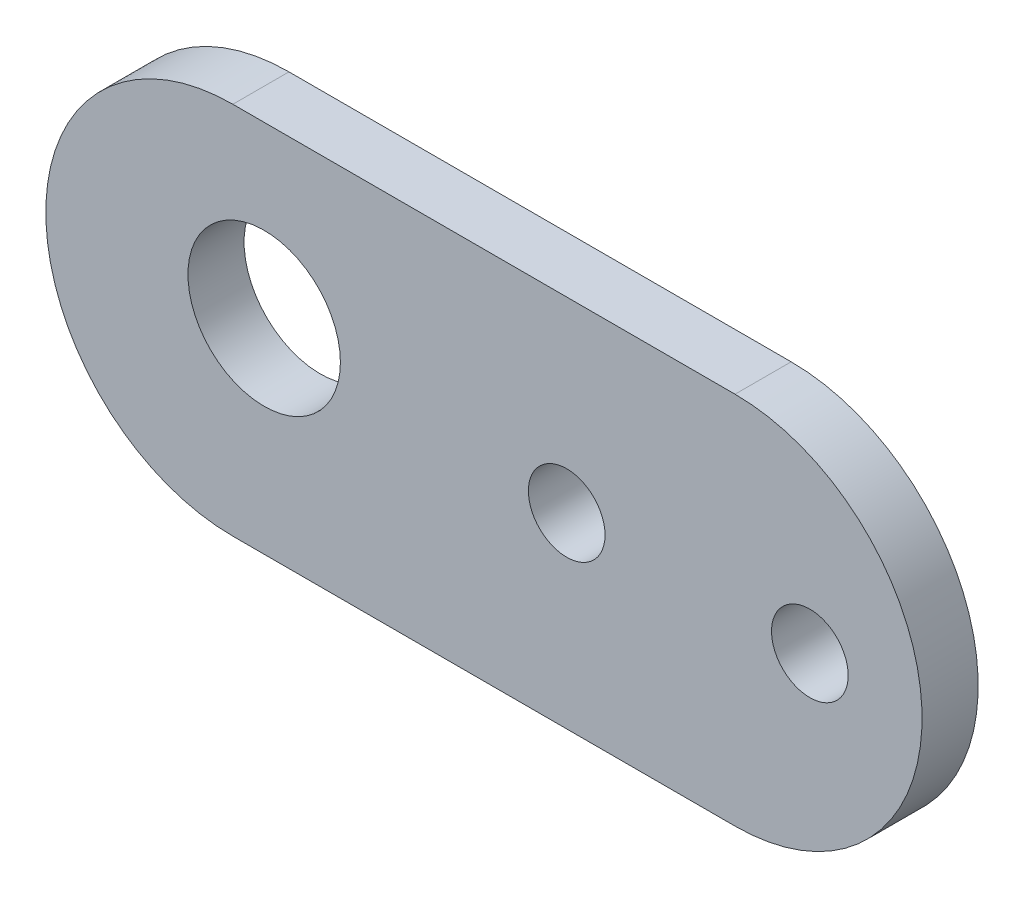
ISO-10303-21;
HEADER;
FILE_DESCRIPTION(('STEP AP214'),'2;1');
FILE_NAME('part.step','',(''),(''),'','','');
FILE_SCHEMA(('AUTOMOTIVE_DESIGN { 1 0 10303 214 1 1 1 1 }'));
ENDSEC;
DATA;
#1=APPLICATION_CONTEXT('core data for automotive mechanical design processes');
#2=APPLICATION_PROTOCOL_DEFINITION('international standard','automotive_design',2000,#1);
#3=PRODUCT_CONTEXT('',#1,'mechanical');
#4=PRODUCT('Part','Part','',(#3));
#5=PRODUCT_RELATED_PRODUCT_CATEGORY('part','',(#4));
#6=PRODUCT_DEFINITION_FORMATION('','',#4);
#7=PRODUCT_DEFINITION_CONTEXT('part definition',#1,'design');
#8=PRODUCT_DEFINITION('design','',#6,#7);
#9=PRODUCT_DEFINITION_SHAPE('','',#8);
#10=(LENGTH_UNIT() NAMED_UNIT(*) SI_UNIT(.MILLI.,.METRE.));
#11=(NAMED_UNIT(*) PLANE_ANGLE_UNIT() SI_UNIT($,.RADIAN.));
#12=(NAMED_UNIT(*) SI_UNIT($,.STERADIAN.) SOLID_ANGLE_UNIT());
#13=UNCERTAINTY_MEASURE_WITH_UNIT(LENGTH_MEASURE(1.E-05),#10,'distance_accuracy_value','');
#14=(GEOMETRIC_REPRESENTATION_CONTEXT(3) GLOBAL_UNCERTAINTY_ASSIGNED_CONTEXT((#13)) GLOBAL_UNIT_ASSIGNED_CONTEXT((#10,
#11,#12)) REPRESENTATION_CONTEXT('',''));
#15=CARTESIAN_POINT('',(0.,0.,0.));
#16=DIRECTION('',(0.,0.,1.));
#17=DIRECTION('',(1.,0.,0.));
#18=AXIS2_PLACEMENT_3D('',#15,#16,#17);
#19=CARTESIAN_POINT('',(-13.425,0.,1.5));
#20=DIRECTION('',(0.,0.,-1.));
#21=DIRECTION('',(-1.,0.,0.));
#22=AXIS2_PLACEMENT_3D('',#19,#20,#21);
#23=CYLINDRICAL_SURFACE('',#22,10.);
#24=CARTESIAN_POINT('',(-13.425,0.,-1.5));
#25=DIRECTION('',(0.,0.,1.));
#26=DIRECTION('',(1.,0.,0.));
#27=AXIS2_PLACEMENT_3D('',#24,#25,#26);
#28=CIRCLE('',#27,10.);
#29=CARTESIAN_POINT('',(-13.425,10.,-1.5));
#30=VERTEX_POINT('',#29);
#31=CARTESIAN_POINT('',(-13.425,-10.,-1.5));
#32=VERTEX_POINT('',#31);
#33=EDGE_CURVE('E95',#30,#32,#28,.T.);
#34=ORIENTED_EDGE('',*,*,#33,.T.);
#35=DIRECTION('',(0.,0.,-1.));
#36=VECTOR('',#35,1.);
#37=CARTESIAN_POINT('',(-13.425,-10.,1.5));
#38=LINE('',#37,#36);
#39=CARTESIAN_POINT('',(-13.425,-10.,1.5));
#40=VERTEX_POINT('',#39);
#41=EDGE_CURVE('E11',#40,#32,#38,.T.);
#42=ORIENTED_EDGE('',*,*,#41,.F.);
#43=CARTESIAN_POINT('',(-13.425,0.,1.5));
#44=DIRECTION('',(0.,0.,1.));
#45=DIRECTION('',(1.,0.,0.));
#46=AXIS2_PLACEMENT_3D('',#43,#44,#45);
#47=CIRCLE('',#46,10.);
#48=CARTESIAN_POINT('',(-13.425,10.,1.5));
#49=VERTEX_POINT('',#48);
#50=EDGE_CURVE('E83',#49,#40,#47,.T.);
#51=ORIENTED_EDGE('',*,*,#50,.F.);
#52=DIRECTION('',(0.,0.,-1.));
#53=VECTOR('',#52,1.);
#54=CARTESIAN_POINT('',(-13.425,10.,1.5));
#55=LINE('',#54,#53);
#56=EDGE_CURVE('E91',#49,#30,#55,.T.);
#57=ORIENTED_EDGE('',*,*,#56,.T.);
#58=EDGE_LOOP('',(#34,#42,#51,#57));
#59=FACE_BOUND('',#58,.T.);
#60=ADVANCED_FACE('F32',(#59),#23,.T.);
#61=CARTESIAN_POINT('',(-13.425,-10.,1.5));
#62=DIRECTION('',(0.,1.,0.));
#63=DIRECTION('',(0.,0.,1.));
#64=AXIS2_PLACEMENT_3D('',#61,#62,#63);
#65=PLANE('',#64);
#66=DIRECTION('',(1.,0.,0.));
#67=VECTOR('',#66,1.);
#68=CARTESIAN_POINT('',(-13.425,-10.,-1.5));
#69=LINE('',#68,#67);
#70=CARTESIAN_POINT('',(13.425,-10.,-1.5));
#71=VERTEX_POINT('',#70);
#72=EDGE_CURVE('E87',#32,#71,#69,.T.);
#73=ORIENTED_EDGE('',*,*,#72,.T.);
#74=DIRECTION('',(0.,0.,-1.));
#75=VECTOR('',#74,1.);
#76=CARTESIAN_POINT('',(13.425,-10.,1.5));
#77=LINE('',#76,#75);
#78=CARTESIAN_POINT('',(13.425,-10.,1.5));
#79=VERTEX_POINT('',#78);
#80=EDGE_CURVE('E40',#79,#71,#77,.T.);
#81=ORIENTED_EDGE('',*,*,#80,.F.);
#82=DIRECTION('',(1.,0.,0.));
#83=VECTOR('',#82,1.);
#84=CARTESIAN_POINT('',(-13.425,-10.,1.5));
#85=LINE('',#84,#83);
#86=EDGE_CURVE('E78',#40,#79,#85,.T.);
#87=ORIENTED_EDGE('',*,*,#86,.F.);
#88=ORIENTED_EDGE('',*,*,#41,.T.);
#89=EDGE_LOOP('',(#73,#81,#87,#88));
#90=FACE_BOUND('',#89,.T.);
#91=ADVANCED_FACE('F86',(#90),#65,.F.);
#92=CARTESIAN_POINT('',(13.425,0.,1.5));
#93=DIRECTION('',(0.,0.,-1.));
#94=DIRECTION('',(-1.,0.,0.));
#95=AXIS2_PLACEMENT_3D('',#92,#93,#94);
#96=CYLINDRICAL_SURFACE('',#95,10.);
#97=CARTESIAN_POINT('',(13.425,0.,-1.5));
#98=DIRECTION('',(0.,0.,1.));
#99=DIRECTION('',(1.,0.,0.));
#100=AXIS2_PLACEMENT_3D('',#97,#98,#99);
#101=CIRCLE('',#100,10.);
#102=CARTESIAN_POINT('',(13.425,10.,-1.5));
#103=VERTEX_POINT('',#102);
#104=EDGE_CURVE('E65',#71,#103,#101,.T.);
#105=ORIENTED_EDGE('',*,*,#104,.T.);
#106=DIRECTION('',(0.,0.,-1.));
#107=VECTOR('',#106,1.);
#108=CARTESIAN_POINT('',(13.425,10.,1.5));
#109=LINE('',#108,#107);
#110=CARTESIAN_POINT('',(13.425,10.,1.5));
#111=VERTEX_POINT('',#110);
#112=EDGE_CURVE('E88',#111,#103,#109,.T.);
#113=ORIENTED_EDGE('',*,*,#112,.F.);
#114=CARTESIAN_POINT('',(13.425,0.,1.5));
#115=DIRECTION('',(0.,0.,1.));
#116=DIRECTION('',(1.,0.,0.));
#117=AXIS2_PLACEMENT_3D('',#114,#115,#116);
#118=CIRCLE('',#117,10.);
#119=EDGE_CURVE('E81',#79,#111,#118,.T.);
#120=ORIENTED_EDGE('',*,*,#119,.F.);
#121=ORIENTED_EDGE('',*,*,#80,.T.);
#122=EDGE_LOOP('',(#105,#113,#120,#121));
#123=FACE_BOUND('',#122,.T.);
#124=ADVANCED_FACE('F89',(#123),#96,.T.);
#125=CARTESIAN_POINT('',(-13.425,10.,1.5));
#126=DIRECTION('',(0.,-1.,0.));
#127=DIRECTION('',(0.,0.,-1.));
#128=AXIS2_PLACEMENT_3D('',#125,#126,#127);
#129=PLANE('',#128);
#130=DIRECTION('',(-1.,0.,0.));
#131=VECTOR('',#130,1.);
#132=CARTESIAN_POINT('',(-13.425,10.,-1.5));
#133=LINE('',#132,#131);
#134=EDGE_CURVE('E71',#103,#30,#133,.T.);
#135=ORIENTED_EDGE('',*,*,#134,.T.);
#136=ORIENTED_EDGE('',*,*,#56,.F.);
#137=DIRECTION('',(-1.,0.,0.));
#138=VECTOR('',#137,1.);
#139=CARTESIAN_POINT('',(-13.425,10.,1.5));
#140=LINE('',#139,#138);
#141=EDGE_CURVE('E48',#111,#49,#140,.T.);
#142=ORIENTED_EDGE('',*,*,#141,.F.);
#143=ORIENTED_EDGE('',*,*,#112,.T.);
#144=EDGE_LOOP('',(#135,#136,#142,#143));
#145=FACE_BOUND('',#144,.T.);
#146=ADVANCED_FACE('F103',(#145),#129,.F.);
#147=CARTESIAN_POINT('',(-13.425,0.,1.5));
#148=DIRECTION('',(0.,0.,1.));
#149=DIRECTION('',(1.,0.,0.));
#150=AXIS2_PLACEMENT_3D('',#147,#148,#149);
#151=PLANE('',#150);
#152=CARTESIAN_POINT('',(-11.75,0.925,1.5));
#153=DIRECTION('',(0.,0.,1.));
#154=DIRECTION('',(1.,0.,0.));
#155=AXIS2_PLACEMENT_3D('',#152,#153,#154);
#156=CIRCLE('',#155,4.075);
#157=CARTESIAN_POINT('',(-7.675,0.925,1.5));
#158=VERTEX_POINT('',#157);
#159=EDGE_CURVE('E121',#158,#158,#156,.T.);
#160=ORIENTED_EDGE('',*,*,#159,.F.);
#161=EDGE_LOOP('',(#160));
#162=FACE_BOUND('',#161,.T.);
#163=CARTESIAN_POINT('',(4.425,0.,1.5));
#164=DIRECTION('',(0.,0.,1.));
#165=DIRECTION('',(1.,0.,0.));
#166=AXIS2_PLACEMENT_3D('',#163,#164,#165);
#167=CIRCLE('',#166,2.05);
#168=CARTESIAN_POINT('',(6.475,0.,1.5));
#169=VERTEX_POINT('',#168);
#170=EDGE_CURVE('E116',#169,#169,#167,.T.);
#171=ORIENTED_EDGE('',*,*,#170,.F.);
#172=EDGE_LOOP('',(#171));
#173=FACE_BOUND('',#172,.T.);
#174=CARTESIAN_POINT('',(17.425,0.,1.5));
#175=DIRECTION('',(0.,0.,1.));
#176=DIRECTION('',(1.,0.,0.));
#177=AXIS2_PLACEMENT_3D('',#174,#175,#176);
#178=CIRCLE('',#177,2.05);
#179=CARTESIAN_POINT('',(19.475,0.,1.5));
#180=VERTEX_POINT('',#179);
#181=EDGE_CURVE('E109',#180,#180,#178,.T.);
#182=ORIENTED_EDGE('',*,*,#181,.F.);
#183=EDGE_LOOP('',(#182));
#184=FACE_BOUND('',#183,.T.);
#185=ORIENTED_EDGE('',*,*,#50,.T.);
#186=ORIENTED_EDGE('',*,*,#86,.T.);
#187=ORIENTED_EDGE('',*,*,#119,.T.);
#188=ORIENTED_EDGE('',*,*,#141,.T.);
#189=EDGE_LOOP('',(#185,#186,#187,#188));
#190=FACE_BOUND('',#189,.T.);
#191=ADVANCED_FACE('F79',(#162,#173,#184,#190),#151,.T.);
#192=CARTESIAN_POINT('',(-13.425,0.,-1.5));
#193=DIRECTION('',(0.,0.,1.));
#194=DIRECTION('',(1.,0.,0.));
#195=AXIS2_PLACEMENT_3D('',#192,#193,#194);
#196=PLANE('',#195);
#197=CARTESIAN_POINT('',(-11.75,0.925,-1.5));
#198=DIRECTION('',(0.,0.,1.));
#199=DIRECTION('',(1.,0.,0.));
#200=AXIS2_PLACEMENT_3D('',#197,#198,#199);
#201=CIRCLE('',#200,4.075);
#202=CARTESIAN_POINT('',(-7.675,0.925,-1.5));
#203=VERTEX_POINT('',#202);
#204=EDGE_CURVE('E113',#203,#203,#201,.T.);
#205=ORIENTED_EDGE('',*,*,#204,.T.);
#206=EDGE_LOOP('',(#205));
#207=FACE_BOUND('',#206,.T.);
#208=CARTESIAN_POINT('',(4.425,0.,-1.5));
#209=DIRECTION('',(0.,0.,1.));
#210=DIRECTION('',(1.,0.,0.));
#211=AXIS2_PLACEMENT_3D('',#208,#209,#210);
#212=CIRCLE('',#211,2.05);
#213=CARTESIAN_POINT('',(6.475,0.,-1.5));
#214=VERTEX_POINT('',#213);
#215=EDGE_CURVE('E98',#214,#214,#212,.T.);
#216=ORIENTED_EDGE('',*,*,#215,.T.);
#217=EDGE_LOOP('',(#216));
#218=FACE_BOUND('',#217,.T.);
#219=CARTESIAN_POINT('',(17.425,0.,-1.5));
#220=DIRECTION('',(0.,0.,1.));
#221=DIRECTION('',(1.,0.,0.));
#222=AXIS2_PLACEMENT_3D('',#219,#220,#221);
#223=CIRCLE('',#222,2.05);
#224=CARTESIAN_POINT('',(19.475,0.,-1.5));
#225=VERTEX_POINT('',#224);
#226=EDGE_CURVE('E112',#225,#225,#223,.T.);
#227=ORIENTED_EDGE('',*,*,#226,.T.);
#228=EDGE_LOOP('',(#227));
#229=FACE_BOUND('',#228,.T.);
#230=ORIENTED_EDGE('',*,*,#33,.F.);
#231=ORIENTED_EDGE('',*,*,#134,.F.);
#232=ORIENTED_EDGE('',*,*,#104,.F.);
#233=ORIENTED_EDGE('',*,*,#72,.F.);
#234=EDGE_LOOP('',(#230,#231,#232,#233));
#235=FACE_BOUND('',#234,.T.);
#236=ADVANCED_FACE('F106',(#207,#218,#229,#235),#196,.F.);
#237=CARTESIAN_POINT('',(17.425,0.,-1.5));
#238=DIRECTION('',(0.,0.,1.));
#239=DIRECTION('',(1.,0.,0.));
#240=AXIS2_PLACEMENT_3D('',#237,#238,#239);
#241=CYLINDRICAL_SURFACE('',#240,2.05);
#242=ORIENTED_EDGE('',*,*,#226,.F.);
#243=EDGE_LOOP('',(#242));
#244=FACE_BOUND('',#243,.T.);
#245=ORIENTED_EDGE('',*,*,#181,.T.);
#246=EDGE_LOOP('',(#245));
#247=FACE_BOUND('',#246,.T.);
#248=ADVANCED_FACE('F143',(#244,#247),#241,.F.);
#249=CARTESIAN_POINT('',(4.425,0.,-1.5));
#250=DIRECTION('',(0.,0.,1.));
#251=DIRECTION('',(1.,0.,0.));
#252=AXIS2_PLACEMENT_3D('',#249,#250,#251);
#253=CYLINDRICAL_SURFACE('',#252,2.05);
#254=ORIENTED_EDGE('',*,*,#215,.F.);
#255=EDGE_LOOP('',(#254));
#256=FACE_BOUND('',#255,.T.);
#257=ORIENTED_EDGE('',*,*,#170,.T.);
#258=EDGE_LOOP('',(#257));
#259=FACE_BOUND('',#258,.T.);
#260=ADVANCED_FACE('F132',(#256,#259),#253,.F.);
#261=CARTESIAN_POINT('',(-11.75,0.925,-1.5));
#262=DIRECTION('',(0.,0.,1.));
#263=DIRECTION('',(1.,0.,0.));
#264=AXIS2_PLACEMENT_3D('',#261,#262,#263);
#265=CYLINDRICAL_SURFACE('',#264,4.075);
#266=ORIENTED_EDGE('',*,*,#204,.F.);
#267=EDGE_LOOP('',(#266));
#268=FACE_BOUND('',#267,.T.);
#269=ORIENTED_EDGE('',*,*,#159,.T.);
#270=EDGE_LOOP('',(#269));
#271=FACE_BOUND('',#270,.T.);
#272=ADVANCED_FACE('F129',(#268,#271),#265,.F.);
#273=CLOSED_SHELL('',(#60,#91,#124,#146,#191,#236,#248,#260,#272));
#274=MANIFOLD_SOLID_BREP('B2',#273);
#275=ADVANCED_BREP_SHAPE_REPRESENTATION('',(#18,#274),#14);
#276=SHAPE_DEFINITION_REPRESENTATION(#9,#275);
ENDSEC;
END-ISO-10303-21;
